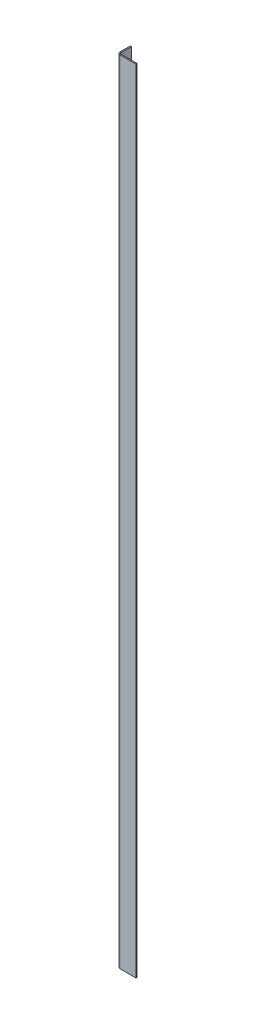
ISO-10303-21;
HEADER;
FILE_DESCRIPTION(('STEP AP214'),'2;1');
FILE_NAME('part.step','',(''),(''),'','','');
FILE_SCHEMA(('AUTOMOTIVE_DESIGN { 1 0 10303 214 1 1 1 1 }'));
ENDSEC;
DATA;
#1=APPLICATION_CONTEXT('core data for automotive mechanical design processes');
#2=APPLICATION_PROTOCOL_DEFINITION('international standard','automotive_design',2000,#1);
#3=PRODUCT_CONTEXT('',#1,'mechanical');
#4=PRODUCT('Part','Part','',(#3));
#5=PRODUCT_RELATED_PRODUCT_CATEGORY('part','',(#4));
#6=PRODUCT_DEFINITION_FORMATION('','',#4);
#7=PRODUCT_DEFINITION_CONTEXT('part definition',#1,'design');
#8=PRODUCT_DEFINITION('design','',#6,#7);
#9=PRODUCT_DEFINITION_SHAPE('','',#8);
#10=(LENGTH_UNIT() NAMED_UNIT(*) SI_UNIT(.MILLI.,.METRE.));
#11=(NAMED_UNIT(*) PLANE_ANGLE_UNIT() SI_UNIT($,.RADIAN.));
#12=(NAMED_UNIT(*) SI_UNIT($,.STERADIAN.) SOLID_ANGLE_UNIT());
#13=UNCERTAINTY_MEASURE_WITH_UNIT(LENGTH_MEASURE(1.E-05),#10,'distance_accuracy_value','');
#14=(GEOMETRIC_REPRESENTATION_CONTEXT(3) GLOBAL_UNCERTAINTY_ASSIGNED_CONTEXT((#13)) GLOBAL_UNIT_ASSIGNED_CONTEXT((#10,
#11,#12)) REPRESENTATION_CONTEXT('',''));
#15=CARTESIAN_POINT('',(0.,0.,0.));
#16=DIRECTION('',(0.,0.,1.));
#17=DIRECTION('',(1.,0.,0.));
#18=AXIS2_PLACEMENT_3D('',#15,#16,#17);
#19=CARTESIAN_POINT('',(-14.1040801287425,1727.2,27.7612264950099));
#20=DIRECTION('',(0.,1.,0.));
#21=DIRECTION('',(0.,0.,1.));
#22=AXIS2_PLACEMENT_3D('',#19,#20,#21);
#23=PLANE('',#22);
#24=DIRECTION('',(0.,0.,1.));
#25=VECTOR('',#24,1.);
#26=CARTESIAN_POINT('',(-14.1040801287425,1727.2,27.7612264950099));
#27=LINE('',#26,#25);
#28=CARTESIAN_POINT('',(-14.1040801287425,1727.2,27.7612264950099));
#29=VERTEX_POINT('',#28);
#30=CARTESIAN_POINT('',(-14.1040801287425,1727.2,30.1424764950099));
#31=VERTEX_POINT('',#30);
#32=EDGE_CURVE('E11',#29,#31,#27,.T.);
#33=ORIENTED_EDGE('',*,*,#32,.F.);
#34=CARTESIAN_POINT('',(-14.1040801287426,1727.2,24.5862264950099));
#35=DIRECTION('',(0.,1.,0.));
#36=DIRECTION('',(0.,0.,1.));
#37=AXIS2_PLACEMENT_3D('',#34,#35,#36);
#38=CIRCLE('',#37,3.175);
#39=CARTESIAN_POINT('',(-17.2790801287426,1727.2,24.5862264950099));
#40=VERTEX_POINT('',#39);
#41=EDGE_CURVE('E134',#40,#29,#38,.T.);
#42=ORIENTED_EDGE('',*,*,#41,.F.);
#43=DIRECTION('',(1.,0.,0.));
#44=VECTOR('',#43,1.);
#45=CARTESIAN_POINT('',(-19.6603301287426,1727.2,24.5862264950099));
#46=LINE('',#45,#44);
#47=CARTESIAN_POINT('',(-19.6603301287426,1727.2,24.5862264950099));
#48=VERTEX_POINT('',#47);
#49=EDGE_CURVE('E45',#48,#40,#46,.T.);
#50=ORIENTED_EDGE('',*,*,#49,.F.);
#51=CARTESIAN_POINT('',(-14.1040801287426,1727.2,24.5862264950099));
#52=DIRECTION('',(0.,1.,0.));
#53=DIRECTION('',(1.,0.,0.));
#54=AXIS2_PLACEMENT_3D('',#51,#52,#53);
#55=CIRCLE('',#54,5.55625);
#56=EDGE_CURVE('E127',#48,#31,#55,.T.);
#57=ORIENTED_EDGE('',*,*,#56,.T.);
#58=EDGE_LOOP('',(#33,#42,#50,#57));
#59=FACE_BOUND('',#58,.T.);
#60=ADVANCED_FACE('F37',(#59),#23,.T.);
#61=CARTESIAN_POINT('',(-19.6603301287426,1727.2,24.5862264950099));
#62=DIRECTION('',(0.,1.,0.));
#63=DIRECTION('',(0.,0.,1.));
#64=AXIS2_PLACEMENT_3D('',#61,#62,#63);
#65=PLANE('',#64);
#66=DIRECTION('',(1.,0.,0.));
#67=VECTOR('',#66,1.);
#68=CARTESIAN_POINT('',(20.8209198712574,1727.2,27.7612264950099));
#69=LINE('',#68,#67);
#70=CARTESIAN_POINT('',(20.8209198712574,1727.2,27.7612264950099));
#71=VERTEX_POINT('',#70);
#72=EDGE_CURVE('E183',#29,#71,#69,.T.);
#73=ORIENTED_EDGE('',*,*,#72,.F.);
#74=ORIENTED_EDGE('',*,*,#32,.T.);
#75=DIRECTION('',(1.,0.,0.));
#76=VECTOR('',#75,1.);
#77=CARTESIAN_POINT('',(20.8209198712574,1727.2,30.1424764950099));
#78=LINE('',#77,#76);
#79=CARTESIAN_POINT('',(20.8209198712574,1727.2,30.1424764950099));
#80=VERTEX_POINT('',#79);
#81=EDGE_CURVE('E93',#31,#80,#78,.T.);
#82=ORIENTED_EDGE('',*,*,#81,.T.);
#83=DIRECTION('',(0.,0.,1.));
#84=VECTOR('',#83,1.);
#85=CARTESIAN_POINT('',(20.8209198712574,1727.2,27.7612264950099));
#86=LINE('',#85,#84);
#87=EDGE_CURVE('E340',#71,#80,#86,.T.);
#88=ORIENTED_EDGE('',*,*,#87,.F.);
#89=EDGE_LOOP('',(#73,#74,#82,#88));
#90=FACE_BOUND('',#89,.T.);
#91=ADVANCED_FACE('F191',(#90),#65,.T.);
#92=CARTESIAN_POINT('',(-17.2790801287426,0.,24.5862264950099));
#93=DIRECTION('',(0.,-1.,0.));
#94=DIRECTION('',(0.,0.,-1.));
#95=AXIS2_PLACEMENT_3D('',#92,#93,#94);
#96=PLANE('',#95);
#97=DIRECTION('',(-1.,0.,0.));
#98=VECTOR('',#97,1.);
#99=CARTESIAN_POINT('',(-17.2790801287426,0.,24.5862264950099));
#100=LINE('',#99,#98);
#101=CARTESIAN_POINT('',(-17.2790801287426,0.,24.5862264950099));
#102=VERTEX_POINT('',#101);
#103=CARTESIAN_POINT('',(-19.6603301287426,0.,24.5862264950099));
#104=VERTEX_POINT('',#103);
#105=EDGE_CURVE('E80',#102,#104,#100,.T.);
#106=ORIENTED_EDGE('',*,*,#105,.F.);
#107=CARTESIAN_POINT('',(-14.1040801287426,0.,24.5862264950099));
#108=DIRECTION('',(0.,1.,0.));
#109=DIRECTION('',(0.,0.,1.));
#110=AXIS2_PLACEMENT_3D('',#107,#108,#109);
#111=CIRCLE('',#110,3.175);
#112=CARTESIAN_POINT('',(-14.1040801287425,0.,27.7612264950099));
#113=VERTEX_POINT('',#112);
#114=EDGE_CURVE('E149',#102,#113,#111,.T.);
#115=ORIENTED_EDGE('',*,*,#114,.T.);
#116=DIRECTION('',(0.,0.,-1.));
#117=VECTOR('',#116,1.);
#118=CARTESIAN_POINT('',(-14.1040801287425,0.,30.1424764950099));
#119=LINE('',#118,#117);
#120=CARTESIAN_POINT('',(-14.1040801287425,0.,30.1424764950099));
#121=VERTEX_POINT('',#120);
#122=EDGE_CURVE('E87',#121,#113,#119,.T.);
#123=ORIENTED_EDGE('',*,*,#122,.F.);
#124=CARTESIAN_POINT('',(-14.1040801287426,0.,24.5862264950099));
#125=DIRECTION('',(0.,1.,0.));
#126=DIRECTION('',(1.,0.,0.));
#127=AXIS2_PLACEMENT_3D('',#124,#125,#126);
#128=CIRCLE('',#127,5.55625);
#129=EDGE_CURVE('E156',#104,#121,#128,.T.);
#130=ORIENTED_EDGE('',*,*,#129,.F.);
#131=EDGE_LOOP('',(#106,#115,#123,#130));
#132=FACE_BOUND('',#131,.T.);
#133=ADVANCED_FACE('F189',(#132),#96,.T.);
#134=CARTESIAN_POINT('',(-14.1040801287425,0.,30.1424764950099));
#135=DIRECTION('',(0.,-1.,0.));
#136=DIRECTION('',(0.,0.,-1.));
#137=AXIS2_PLACEMENT_3D('',#134,#135,#136);
#138=PLANE('',#137);
#139=DIRECTION('',(0.,0.,1.));
#140=VECTOR('',#139,1.);
#141=CARTESIAN_POINT('',(-17.2790801287426,0.,2.3612264950099));
#142=LINE('',#141,#140);
#143=CARTESIAN_POINT('',(-17.2790801287426,0.,2.3612264950099));
#144=VERTEX_POINT('',#143);
#145=EDGE_CURVE('E151',#144,#102,#142,.T.);
#146=ORIENTED_EDGE('',*,*,#145,.T.);
#147=ORIENTED_EDGE('',*,*,#105,.T.);
#148=DIRECTION('',(0.,0.,1.));
#149=VECTOR('',#148,1.);
#150=CARTESIAN_POINT('',(-19.6603301287426,0.,2.3612264950099));
#151=LINE('',#150,#149);
#152=CARTESIAN_POINT('',(-19.6603301287426,0.,2.3612264950099));
#153=VERTEX_POINT('',#152);
#154=EDGE_CURVE('E154',#153,#104,#151,.T.);
#155=ORIENTED_EDGE('',*,*,#154,.F.);
#156=DIRECTION('',(1.,0.,0.));
#157=VECTOR('',#156,1.);
#158=CARTESIAN_POINT('',(-19.6603301287426,0.,2.3612264950099));
#159=LINE('',#158,#157);
#160=EDGE_CURVE('E115',#153,#144,#159,.T.);
#161=ORIENTED_EDGE('',*,*,#160,.T.);
#162=EDGE_LOOP('',(#146,#147,#155,#161));
#163=FACE_BOUND('',#162,.T.);
#164=ADVANCED_FACE('F185',(#163),#138,.T.);
#165=CARTESIAN_POINT('',(20.8209198712574,1727.2,30.1424764950099));
#166=DIRECTION('',(0.,0.,-1.));
#167=DIRECTION('',(-1.,0.,0.));
#168=AXIS2_PLACEMENT_3D('',#165,#166,#167);
#169=PLANE('',#168);
#170=DIRECTION('',(1.,0.,0.));
#171=VECTOR('',#170,1.);
#172=CARTESIAN_POINT('',(20.8209198712574,0.,30.1424764950099));
#173=LINE('',#172,#171);
#174=CARTESIAN_POINT('',(20.8209198712574,0.,30.1424764950099));
#175=VERTEX_POINT('',#174);
#176=EDGE_CURVE('E140',#121,#175,#173,.T.);
#177=ORIENTED_EDGE('',*,*,#176,.T.);
#178=DIRECTION('',(0.,-1.,0.));
#179=VECTOR('',#178,1.);
#180=CARTESIAN_POINT('',(20.8209198712574,1727.2,30.1424764950099));
#181=LINE('',#180,#179);
#182=EDGE_CURVE('E170',#80,#175,#181,.T.);
#183=ORIENTED_EDGE('',*,*,#182,.F.);
#184=ORIENTED_EDGE('',*,*,#81,.F.);
#185=DIRECTION('',(0.,-1.,0.));
#186=VECTOR('',#185,1.);
#187=CARTESIAN_POINT('',(-14.1040801287425,1727.2,30.1424764950099));
#188=LINE('',#187,#186);
#189=EDGE_CURVE('E139',#31,#121,#188,.T.);
#190=ORIENTED_EDGE('',*,*,#189,.T.);
#191=EDGE_LOOP('',(#177,#183,#184,#190));
#192=FACE_BOUND('',#191,.T.);
#193=ADVANCED_FACE('F197',(#192),#169,.F.);
#194=CARTESIAN_POINT('',(20.8209198712574,1727.2,27.7612264950099));
#195=DIRECTION('',(1.,0.,0.));
#196=DIRECTION('',(0.,0.,-1.));
#197=AXIS2_PLACEMENT_3D('',#194,#195,#196);
#198=PLANE('',#197);
#199=DIRECTION('',(0.,0.,1.));
#200=VECTOR('',#199,1.);
#201=CARTESIAN_POINT('',(20.8209198712574,0.,27.7612264950099));
#202=LINE('',#201,#200);
#203=CARTESIAN_POINT('',(20.8209198712574,0.,27.7612264950099));
#204=VERTEX_POINT('',#203);
#205=EDGE_CURVE('E143',#204,#175,#202,.T.);
#206=ORIENTED_EDGE('',*,*,#205,.F.);
#207=DIRECTION('',(0.,-1.,0.));
#208=VECTOR('',#207,1.);
#209=CARTESIAN_POINT('',(20.8209198712574,1727.2,27.7612264950099));
#210=LINE('',#209,#208);
#211=EDGE_CURVE('E168',#71,#204,#210,.T.);
#212=ORIENTED_EDGE('',*,*,#211,.F.);
#213=ORIENTED_EDGE('',*,*,#87,.T.);
#214=ORIENTED_EDGE('',*,*,#182,.T.);
#215=EDGE_LOOP('',(#206,#212,#213,#214));
#216=FACE_BOUND('',#215,.T.);
#217=ADVANCED_FACE('F228',(#216),#198,.T.);
#218=CARTESIAN_POINT('',(20.8209198712574,1727.2,27.7612264950099));
#219=DIRECTION('',(0.,0.,-1.));
#220=DIRECTION('',(-1.,0.,0.));
#221=AXIS2_PLACEMENT_3D('',#218,#219,#220);
#222=PLANE('',#221);
#223=DIRECTION('',(1.,0.,0.));
#224=VECTOR('',#223,1.);
#225=CARTESIAN_POINT('',(20.8209198712574,0.,27.7612264950099));
#226=LINE('',#225,#224);
#227=EDGE_CURVE('E146',#113,#204,#226,.T.);
#228=ORIENTED_EDGE('',*,*,#227,.F.);
#229=DIRECTION('',(0.,-1.,0.));
#230=VECTOR('',#229,1.);
#231=CARTESIAN_POINT('',(-14.1040801287425,1727.2,27.7612264950099));
#232=LINE('',#231,#230);
#233=EDGE_CURVE('E165',#29,#113,#232,.T.);
#234=ORIENTED_EDGE('',*,*,#233,.F.);
#235=ORIENTED_EDGE('',*,*,#72,.T.);
#236=ORIENTED_EDGE('',*,*,#211,.T.);
#237=EDGE_LOOP('',(#228,#234,#235,#236));
#238=FACE_BOUND('',#237,.T.);
#239=ADVANCED_FACE('F239',(#238),#222,.T.);
#240=CARTESIAN_POINT('',(-14.1040801287426,1727.2,24.5862264950099));
#241=DIRECTION('',(0.,-1.,0.));
#242=DIRECTION('',(0.,0.,-1.));
#243=AXIS2_PLACEMENT_3D('',#240,#241,#242);
#244=CYLINDRICAL_SURFACE('',#243,3.175);
#245=ORIENTED_EDGE('',*,*,#114,.F.);
#246=DIRECTION('',(0.,-1.,0.));
#247=VECTOR('',#246,1.);
#248=CARTESIAN_POINT('',(-17.2790801287426,1727.2,24.5862264950099));
#249=LINE('',#248,#247);
#250=EDGE_CURVE('E162',#40,#102,#249,.T.);
#251=ORIENTED_EDGE('',*,*,#250,.F.);
#252=ORIENTED_EDGE('',*,*,#41,.T.);
#253=ORIENTED_EDGE('',*,*,#233,.T.);
#254=EDGE_LOOP('',(#245,#251,#252,#253));
#255=FACE_BOUND('',#254,.T.);
#256=ADVANCED_FACE('F179',(#255),#244,.F.);
#257=CARTESIAN_POINT('',(-17.2790801287426,1727.2,2.3612264950099));
#258=DIRECTION('',(1.,0.,0.));
#259=DIRECTION('',(0.,0.,-1.));
#260=AXIS2_PLACEMENT_3D('',#257,#258,#259);
#261=PLANE('',#260);
#262=ORIENTED_EDGE('',*,*,#145,.F.);
#263=DIRECTION('',(0.,-1.,0.));
#264=VECTOR('',#263,1.);
#265=CARTESIAN_POINT('',(-17.2790801287426,1727.2,2.3612264950099));
#266=LINE('',#265,#264);
#267=CARTESIAN_POINT('',(-17.2790801287426,1727.2,2.3612264950099));
#268=VERTEX_POINT('',#267);
#269=EDGE_CURVE('E117',#268,#144,#266,.T.);
#270=ORIENTED_EDGE('',*,*,#269,.F.);
#271=DIRECTION('',(0.,0.,1.));
#272=VECTOR('',#271,1.);
#273=CARTESIAN_POINT('',(-17.2790801287426,1727.2,2.3612264950099));
#274=LINE('',#273,#272);
#275=EDGE_CURVE('E132',#268,#40,#274,.T.);
#276=ORIENTED_EDGE('',*,*,#275,.T.);
#277=ORIENTED_EDGE('',*,*,#250,.T.);
#278=EDGE_LOOP('',(#262,#270,#276,#277));
#279=FACE_BOUND('',#278,.T.);
#280=ADVANCED_FACE('F184',(#279),#261,.T.);
#281=CARTESIAN_POINT('',(-19.6603301287426,1727.2,2.3612264950099));
#282=DIRECTION('',(0.,0.,-1.));
#283=DIRECTION('',(-1.,0.,0.));
#284=AXIS2_PLACEMENT_3D('',#281,#282,#283);
#285=PLANE('',#284);
#286=ORIENTED_EDGE('',*,*,#160,.F.);
#287=DIRECTION('',(0.,-1.,0.));
#288=VECTOR('',#287,1.);
#289=CARTESIAN_POINT('',(-19.6603301287426,1727.2,2.3612264950099));
#290=LINE('',#289,#288);
#291=CARTESIAN_POINT('',(-19.6603301287426,1727.2,2.3612264950099));
#292=VERTEX_POINT('',#291);
#293=EDGE_CURVE('E109',#292,#153,#290,.T.);
#294=ORIENTED_EDGE('',*,*,#293,.F.);
#295=DIRECTION('',(1.,0.,0.));
#296=VECTOR('',#295,1.);
#297=CARTESIAN_POINT('',(-19.6603301287426,1727.2,2.3612264950099));
#298=LINE('',#297,#296);
#299=EDGE_CURVE('E113',#292,#268,#298,.T.);
#300=ORIENTED_EDGE('',*,*,#299,.T.);
#301=ORIENTED_EDGE('',*,*,#269,.T.);
#302=EDGE_LOOP('',(#286,#294,#300,#301));
#303=FACE_BOUND('',#302,.T.);
#304=ADVANCED_FACE('F111',(#303),#285,.T.);
#305=CARTESIAN_POINT('',(-19.6603301287426,1727.2,2.3612264950099));
#306=DIRECTION('',(1.,0.,0.));
#307=DIRECTION('',(0.,0.,-1.));
#308=AXIS2_PLACEMENT_3D('',#305,#306,#307);
#309=PLANE('',#308);
#310=ORIENTED_EDGE('',*,*,#154,.T.);
#311=DIRECTION('',(0.,-1.,0.));
#312=VECTOR('',#311,1.);
#313=CARTESIAN_POINT('',(-19.6603301287426,1727.2,24.5862264950099));
#314=LINE('',#313,#312);
#315=EDGE_CURVE('E118',#48,#104,#314,.T.);
#316=ORIENTED_EDGE('',*,*,#315,.F.);
#317=DIRECTION('',(0.,0.,1.));
#318=VECTOR('',#317,1.);
#319=CARTESIAN_POINT('',(-19.6603301287426,1727.2,2.3612264950099));
#320=LINE('',#319,#318);
#321=EDGE_CURVE('E122',#292,#48,#320,.T.);
#322=ORIENTED_EDGE('',*,*,#321,.F.);
#323=ORIENTED_EDGE('',*,*,#293,.T.);
#324=EDGE_LOOP('',(#310,#316,#322,#323));
#325=FACE_BOUND('',#324,.T.);
#326=ADVANCED_FACE('F123',(#325),#309,.F.);
#327=CARTESIAN_POINT('',(-14.1040801287426,1727.2,24.5862264950099));
#328=DIRECTION('',(0.,-1.,0.));
#329=DIRECTION('',(0.,0.,-1.));
#330=AXIS2_PLACEMENT_3D('',#327,#328,#329);
#331=CYLINDRICAL_SURFACE('',#330,5.55625);
#332=ORIENTED_EDGE('',*,*,#129,.T.);
#333=ORIENTED_EDGE('',*,*,#189,.F.);
#334=ORIENTED_EDGE('',*,*,#56,.F.);
#335=ORIENTED_EDGE('',*,*,#315,.T.);
#336=EDGE_LOOP('',(#332,#333,#334,#335));
#337=FACE_BOUND('',#336,.T.);
#338=ADVANCED_FACE('F187',(#337),#331,.T.);
#339=CARTESIAN_POINT('',(-14.1040801287426,1727.2,24.5862264950099));
#340=DIRECTION('',(0.,1.,0.));
#341=DIRECTION('',(1.,0.,0.));
#342=AXIS2_PLACEMENT_3D('',#339,#340,#341);
#343=PLANE('',#342);
#344=ORIENTED_EDGE('',*,*,#321,.T.);
#345=ORIENTED_EDGE('',*,*,#49,.T.);
#346=ORIENTED_EDGE('',*,*,#275,.F.);
#347=ORIENTED_EDGE('',*,*,#299,.F.);
#348=EDGE_LOOP('',(#344,#345,#346,#347));
#349=FACE_BOUND('',#348,.T.);
#350=ADVANCED_FACE('F130',(#349),#343,.T.);
#351=CARTESIAN_POINT('',(-14.1040801287426,0.,24.5862264950099));
#352=DIRECTION('',(0.,1.,0.));
#353=DIRECTION('',(1.,0.,0.));
#354=AXIS2_PLACEMENT_3D('',#351,#352,#353);
#355=PLANE('',#354);
#356=ORIENTED_EDGE('',*,*,#176,.F.);
#357=ORIENTED_EDGE('',*,*,#122,.T.);
#358=ORIENTED_EDGE('',*,*,#227,.T.);
#359=ORIENTED_EDGE('',*,*,#205,.T.);
#360=EDGE_LOOP('',(#356,#357,#358,#359));
#361=FACE_BOUND('',#360,.T.);
#362=ADVANCED_FACE('F305',(#361),#355,.F.);
#363=CLOSED_SHELL('',(#60,#91,#133,#164,#193,#217,#239,#256,#280,#304,#326,#338,#350,#362));
#364=MANIFOLD_SOLID_BREP('B2',#363);
#365=ADVANCED_BREP_SHAPE_REPRESENTATION('',(#18,#364),#14);
#366=SHAPE_DEFINITION_REPRESENTATION(#9,#365);
ENDSEC;
END-ISO-10303-21;
